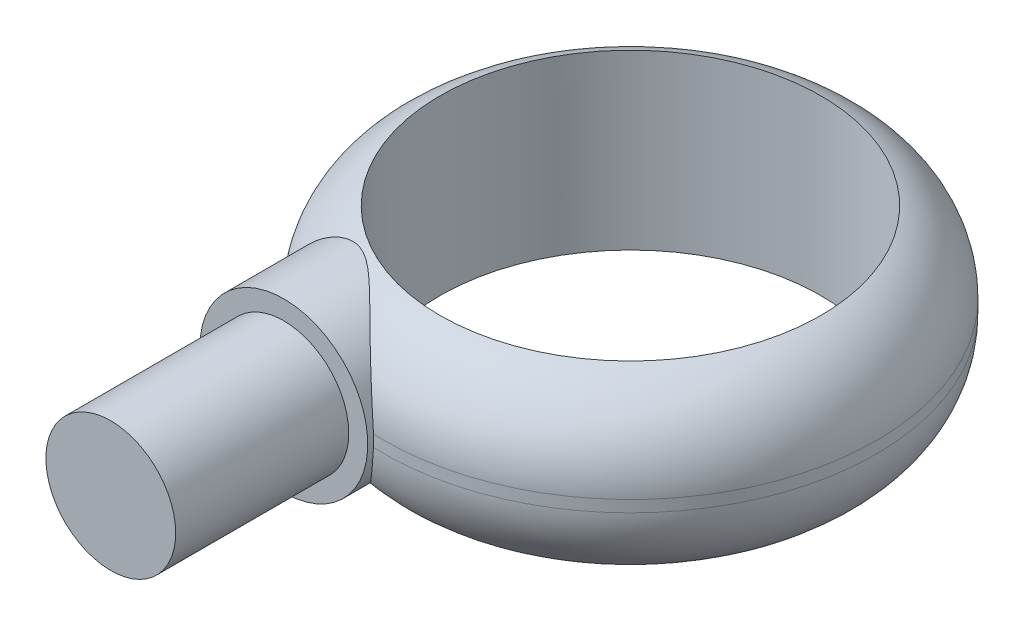
ISO-10303-21;
HEADER;
FILE_DESCRIPTION(('STEP AP214'),'2;1');
FILE_NAME('part.step','',(''),(''),'','','');
FILE_SCHEMA(('AUTOMOTIVE_DESIGN { 1 0 10303 214 1 1 1 1 }'));
ENDSEC;
DATA;
#1=APPLICATION_CONTEXT('core data for automotive mechanical design processes');
#2=APPLICATION_PROTOCOL_DEFINITION('international standard','automotive_design',2000,#1);
#3=PRODUCT_CONTEXT('',#1,'mechanical');
#4=PRODUCT('Part','Part','',(#3));
#5=PRODUCT_RELATED_PRODUCT_CATEGORY('part','',(#4));
#6=PRODUCT_DEFINITION_FORMATION('','',#4);
#7=PRODUCT_DEFINITION_CONTEXT('part definition',#1,'design');
#8=PRODUCT_DEFINITION('design','',#6,#7);
#9=PRODUCT_DEFINITION_SHAPE('','',#8);
#10=(LENGTH_UNIT() NAMED_UNIT(*) SI_UNIT(.MILLI.,.METRE.));
#11=(NAMED_UNIT(*) PLANE_ANGLE_UNIT() SI_UNIT($,.RADIAN.));
#12=(NAMED_UNIT(*) SI_UNIT($,.STERADIAN.) SOLID_ANGLE_UNIT());
#13=UNCERTAINTY_MEASURE_WITH_UNIT(LENGTH_MEASURE(1.E-05),#10,'distance_accuracy_value','');
#14=(GEOMETRIC_REPRESENTATION_CONTEXT(3) GLOBAL_UNCERTAINTY_ASSIGNED_CONTEXT((#13)) GLOBAL_UNIT_ASSIGNED_CONTEXT((#10,
#11,#12)) REPRESENTATION_CONTEXT('',''));
#15=CARTESIAN_POINT('',(0.,0.,0.));
#16=DIRECTION('',(0.,0.,1.));
#17=DIRECTION('',(1.,0.,0.));
#18=AXIS2_PLACEMENT_3D('',#15,#16,#17);
#19=CARTESIAN_POINT('',(0.,0.,12.7));
#20=DIRECTION('',(0.,0.,-1.));
#21=DIRECTION('',(-1.,0.,0.));
#22=AXIS2_PLACEMENT_3D('',#19,#20,#21);
#23=CYLINDRICAL_SURFACE('',#22,4.7625);
#24=CARTESIAN_POINT('',(0.,0.,12.7));
#25=DIRECTION('',(0.,0.,1.));
#26=DIRECTION('',(1.,0.,0.));
#27=AXIS2_PLACEMENT_3D('',#24,#25,#26);
#28=CIRCLE('',#27,4.7625);
#29=CARTESIAN_POINT('',(4.7625,0.,12.7));
#30=VERTEX_POINT('',#29);
#31=EDGE_CURVE('E80',#30,#30,#28,.T.);
#32=ORIENTED_EDGE('',*,*,#31,.F.);
#33=EDGE_LOOP('',(#32));
#34=FACE_BOUND('',#33,.T.);
#35=CARTESIAN_POINT('',(0.,0.,0.));
#36=DIRECTION('',(0.,0.,1.));
#37=DIRECTION('',(1.,0.,0.));
#38=AXIS2_PLACEMENT_3D('',#35,#36,#37);
#39=CIRCLE('',#38,4.7625);
#40=CARTESIAN_POINT('',(4.7625,0.,0.));
#41=VERTEX_POINT('',#40);
#42=EDGE_CURVE('E95',#41,#41,#39,.T.);
#43=ORIENTED_EDGE('',*,*,#42,.T.);
#44=EDGE_LOOP('',(#43));
#45=FACE_BOUND('',#44,.T.);
#46=ADVANCED_FACE('F39',(#34,#45),#23,.T.);
#47=CARTESIAN_POINT('',(0.,0.,12.7));
#48=DIRECTION('',(0.,0.,1.));
#49=DIRECTION('',(1.,0.,0.));
#50=AXIS2_PLACEMENT_3D('',#47,#48,#49);
#51=PLANE('',#50);
#52=ORIENTED_EDGE('',*,*,#31,.T.);
#53=EDGE_LOOP('',(#52));
#54=FACE_BOUND('',#53,.T.);
#55=ADVANCED_FACE('F111',(#54),#51,.T.);
#56=CARTESIAN_POINT('',(0.,0.,-6.35));
#57=DIRECTION('',(0.,0.,1.));
#58=DIRECTION('',(1.,0.,0.));
#59=AXIS2_PLACEMENT_3D('',#56,#57,#58);
#60=CYLINDRICAL_SURFACE('',#59,6.1595);
#61=CARTESIAN_POINT('',(6.1595,0.,-0.433278284133438));
#62=CARTESIAN_POINT('',(6.15950032151189,0.172561450035401,-0.43327843835306));
#63=CARTESIAN_POINT('',(6.15224445738255,0.345117413014048,-0.433606406752898));
#64=CARTESIAN_POINT('',(6.1232683325453,0.689071518725791,-0.43496916231237));
#65=CARTESIAN_POINT('',(6.10154302920773,0.860469236765324,-0.436004195888921));
#66=CARTESIAN_POINT('',(6.04379488401181,1.20072652864007,-0.438929525038681));
#67=CARTESIAN_POINT('',(6.00778050977877,1.36958754431435,-0.440819314181093));
#68=CARTESIAN_POINT('',(5.92169294821484,1.70375331226299,-0.445697540905001));
#69=CARTESIAN_POINT('',(5.87161339677958,1.86905641814388,-0.448686476009523));
#70=CARTESIAN_POINT('',(5.75774408586466,2.19490784656053,-0.456091748109535));
#71=CARTESIAN_POINT('',(5.69394925154568,2.35545438401532,-0.460508613764112));
#72=CARTESIAN_POINT('',(5.55316247789625,2.67050211720941,-0.471167784589842));
#73=CARTESIAN_POINT('',(5.47617665046422,2.82500607217129,-0.477409245296908));
#74=CARTESIAN_POINT('',(5.30952875236692,3.12699526927438,-0.492179614423664));
#75=CARTESIAN_POINT('',(5.21986114654022,3.27447740886317,-0.50070952313835));
#76=CARTESIAN_POINT('',(5.02860373379519,3.56121777171913,-0.520550013009385));
#77=CARTESIAN_POINT('',(4.92701864550526,3.70047921729143,-0.53185949554567));
#78=CARTESIAN_POINT('',(4.71336532211336,3.96899006580956,-0.557697579812131));
#79=CARTESIAN_POINT('',(4.60136550693136,4.09829585082189,-0.572205925763025));
#80=CARTESIAN_POINT('',(4.36731017886511,4.346857637888,-0.604978081559618));
#81=CARTESIAN_POINT('',(4.24525846415549,4.46611740175182,-0.623240476780409));
#82=CARTESIAN_POINT('',(3.99208346154809,4.69379302352241,-0.663998561291359));
#83=CARTESIAN_POINT('',(3.86096019018573,4.8022089011943,-0.686494242865307));
#84=CARTESIAN_POINT('',(3.59076905000158,5.00745431070971,-0.736141451234947));
#85=CARTESIAN_POINT('',(3.4517013000029,5.10428401577706,-0.763292908407787));
#86=CARTESIAN_POINT('',(3.16935236137234,5.28414311422239,-0.822076011198129));
#87=CARTESIAN_POINT('',(3.02618873830594,5.36738577689063,-0.853620197350324));
#88=CARTESIAN_POINT('',(2.73453589388077,5.52168271932362,-0.921791028792808));
#89=CARTESIAN_POINT('',(2.58604486315587,5.59273280978304,-0.958419413199415));
#90=CARTESIAN_POINT('',(2.28510261774511,5.72228743959094,-1.03687614467795));
#91=CARTESIAN_POINT('',(2.132653120489,5.78079732097098,-1.07870226551044));
#92=CARTESIAN_POINT('',(1.82492953139627,5.88519173090113,-1.16762006070106));
#93=CARTESIAN_POINT('',(1.66965440236917,5.93107151949394,-1.21471370261228));
#94=CARTESIAN_POINT('',(1.35655744394011,6.01044446217021,-1.31440412787761));
#95=CARTESIAN_POINT('',(1.19872567216711,6.04385637985861,-1.36703423361447));
#96=CARTESIAN_POINT('',(0.882621161014355,6.09804447484192,-1.47739477722207));
#97=CARTESIAN_POINT('',(0.724348283729284,6.11881611393903,-1.5351270383936));
#98=CARTESIAN_POINT('',(0.40852606262895,6.14798284680408,-1.65540923672245));
#99=CARTESIAN_POINT('',(0.250976630968003,6.15637948509119,-1.71795857163703));
#100=CARTESIAN_POINT('',(-0.0624947411158468,6.16117853526624,-1.84756887140799));
#101=CARTESIAN_POINT('',(-0.21841604173212,6.15757639768461,-1.91463153809947));
#102=CARTESIAN_POINT('',(-0.539060333655555,6.1381187260786,-2.0579293439522));
#103=CARTESIAN_POINT('',(-0.703591071962047,6.1213846482237,-2.13447652050045));
#104=CARTESIAN_POINT('',(-1.02884335916061,6.07518995128125,-2.29176083861418));
#105=CARTESIAN_POINT('',(-1.18956346887423,6.04572460220368,-2.37249952761413));
#106=CARTESIAN_POINT('',(-1.66474224009663,5.93913826731801,-2.62009910049147));
#107=CARTESIAN_POINT('',(-1.97243759451734,5.84381235191416,-2.79244154475768));
#108=CARTESIAN_POINT('',(-2.60419458906947,5.59358539081789,-3.17009994358961));
#109=CARTESIAN_POINT('',(-2.92494660215891,5.43242444301207,-3.37674420701079));
#110=CARTESIAN_POINT('',(-3.53274510596176,5.05833240435006,-3.79442677248294));
#111=CARTESIAN_POINT('',(-3.81972780941989,4.84530560011969,-4.00547253101321));
#112=CARTESIAN_POINT('',(-4.23656070927935,4.47558158558861,-4.32967240217355));
#113=CARTESIAN_POINT('',(-4.37984667569551,4.33553704198602,-4.44490915696216));
#114=CARTESIAN_POINT('',(-4.65355010896379,4.04035118185965,-4.67155336322745));
#115=CARTESIAN_POINT('',(-4.78396363587603,3.88520527185681,-4.78295963552951));
#116=CARTESIAN_POINT('',(-5.03043509633383,3.56028590056275,-4.99916307820575));
#117=CARTESIAN_POINT('',(-5.14652456474335,3.39054601982918,-5.103974508483));
#118=CARTESIAN_POINT('',(-5.36310716621565,3.03638185003433,-5.30413139845406));
#119=CARTESIAN_POINT('',(-5.46361220912722,2.85196893904061,-5.39948406639552));
#120=CARTESIAN_POINT('',(-5.66564902999966,2.42998771231142,-5.59498091581771));
#121=CARTESIAN_POINT('',(-5.7633588049525,2.18916859709919,-5.69226320768031));
#122=CARTESIAN_POINT('',(-5.88775141017033,1.81416522202869,-5.81821526265878));
#123=CARTESIAN_POINT('',(-5.92551607624295,1.68688939211838,-5.8568662123582));
#124=CARTESIAN_POINT('',(-5.99311414389299,1.42823736299574,-5.92655146598141));
#125=CARTESIAN_POINT('',(-6.0229515329071,1.29686326252404,-5.95758959856202));
#126=CARTESIAN_POINT('',(-6.07442075982425,1.02936686377469,-6.01141006281185));
#127=CARTESIAN_POINT('',(-6.09596402569768,0.893209392044427,-6.03410316992073));
#128=CARTESIAN_POINT('',(-6.12992915188676,0.618510492977326,-6.06999034757185));
#129=CARTESIAN_POINT('',(-6.14235126286339,0.479969131259917,-6.08318467915235));
#130=CARTESIAN_POINT('',(-6.15776641483959,0.201841781611924,-6.09957025761734));
#131=CARTESIAN_POINT('',(-6.16076444516669,0.0622563856686954,-6.10276679756081));
#132=CARTESIAN_POINT('',(-6.15726799056568,-0.216651698846653,-6.09904474404152));
#133=CARTESIAN_POINT('',(-6.15077431033838,-0.355974408686477,-6.09212700806023));
#134=CARTESIAN_POINT('',(-6.12994428924225,-0.614617998741855,-6.070023448736));
#135=CARTESIAN_POINT('',(-6.11676291989732,-0.734139922767015,-6.05605651281613));
#136=CARTESIAN_POINT('',(-6.08362640889022,-0.971222571011908,-6.02111739861345));
#137=CARTESIAN_POINT('',(-6.06366915944758,-1.08878267301245,-6.00014304055661));
#138=CARTESIAN_POINT('',(-5.99409481770153,-1.43748975720435,-5.92747928737275));
#139=CARTESIAN_POINT('',(-5.93476895487407,-1.66473676898593,-5.86604244606844));
#140=CARTESIAN_POINT('',(-5.76672341942466,-2.18758946448493,-5.69542786953499));
#141=CARTESIAN_POINT('',(-5.64782379422839,-2.47687359410212,-5.57698686393697));
#142=CARTESIAN_POINT('',(-5.4427934151154,-2.88773872121932,-5.37993168467121));
#143=CARTESIAN_POINT('',(-5.36986675169885,-3.02104245891786,-5.31088989306975));
#144=CARTESIAN_POINT('',(-5.21577711519251,-3.27990230682628,-5.16766581155484));
#145=CARTESIAN_POINT('',(-5.13461612882906,-3.40546027418692,-5.09348476297282));
#146=CARTESIAN_POINT('',(-4.93702853946152,-3.688345241977,-4.91644082313287));
#147=CARTESIAN_POINT('',(-4.81771597460488,-3.84272732748677,-4.81209476024554));
#148=CARTESIAN_POINT('',(-4.56679035149864,-4.13779909740781,-4.59888309712308));
#149=CARTESIAN_POINT('',(-4.43517357590581,-4.27848461744125,-4.49001613659335));
#150=CARTESIAN_POINT('',(-4.16046191498514,-4.54607268090431,-4.2696989950882));
#151=CARTESIAN_POINT('',(-4.01736239222965,-4.67296960646495,-4.15824778348762));
#152=CARTESIAN_POINT('',(-3.72045294694068,-4.91264329924761,-3.93448531304253));
#153=CARTESIAN_POINT('',(-3.56664398014809,-5.02542132397306,-3.82217413173829));
#154=CARTESIAN_POINT('',(-3.24708089733202,-5.23766394281989,-3.59683134434132));
#155=CARTESIAN_POINT('',(-3.08120808766067,-5.3369573501376,-3.48380668134183));
#156=CARTESIAN_POINT('',(-2.73982537424583,-5.51999113631155,-3.25974064178328));
#157=CARTESIAN_POINT('',(-2.56431603189095,-5.60373241993385,-3.14869915019043));
#158=CARTESIAN_POINT('',(-2.20445817822752,-5.75481297729784,-2.92989096558961));
#159=CARTESIAN_POINT('',(-2.02011157850642,-5.82215577920593,-2.82212357252761));
#160=CARTESIAN_POINT('',(-1.64348830047302,-5.93946812769961,-2.6110475934744));
#161=CARTESIAN_POINT('',(-1.4512118433075,-5.98943815840867,-2.50773888330425));
#162=CARTESIAN_POINT('',(-1.06017849980355,-6.07085535531222,-2.30686015265064));
#163=CARTESIAN_POINT('',(-0.861430955572112,-6.10232807427085,-2.2092823838972));
#164=CARTESIAN_POINT('',(-0.458679906550883,-6.14573578544661,-2.02076977130794));
#165=CARTESIAN_POINT('',(-0.254676252495386,-6.15767022218303,-1.92983511640856));
#166=CARTESIAN_POINT('',(0.156548443517792,-6.16093895162116,-1.75564543331562));
#167=CARTESIAN_POINT('',(0.363766287769816,-6.15229255849752,-1.67238328100558));
#168=CARTESIAN_POINT('',(0.779388426859274,-6.1135526349727,-1.51423947578143));
#169=CARTESIAN_POINT('',(0.987792467251654,-6.0834635440055,-1.43935609186383));
#170=CARTESIAN_POINT('',(1.3733745298212,-6.00717637812181,-1.30865137170649));
#171=CARTESIAN_POINT('',(1.55073399844754,-5.96391643965682,-1.25163733155439));
#172=CARTESIAN_POINT('',(1.90274440511578,-5.8611098994337,-1.14433858180218));
#173=CARTESIAN_POINT('',(2.07739567104956,-5.80156528584858,-1.09405305184315));
#174=CARTESIAN_POINT('',(2.42209823143404,-5.66631662962448,-1.00025230058539));
#175=CARTESIAN_POINT('',(2.59215176948205,-5.59062063495201,-0.956733726026318));
#176=CARTESIAN_POINT('',(2.92591550961662,-5.42340199552485,-0.876281838096257));
#177=CARTESIAN_POINT('',(3.08962614175729,-5.33188042606341,-0.839348077655924));
#178=CARTESIAN_POINT('',(3.39232185030053,-5.14392453900254,-0.775253467597338));
#179=CARTESIAN_POINT('',(3.5321090713182,-5.04898749089508,-0.747476022015032));
#180=CARTESIAN_POINT('',(3.80393750675398,-4.8474856993313,-0.696611151680528));
#181=CARTESIAN_POINT('',(3.93597910218585,-4.74092152856157,-0.673523496095837));
#182=CARTESIAN_POINT('',(4.19116444265097,-4.51690212506122,-0.631631035601251));
#183=CARTESIAN_POINT('',(4.31430957158704,-4.39944859275972,-0.612825563586402));
#184=CARTESIAN_POINT('',(4.55070026905666,-4.1544605443126,-0.579026802333554));
#185=CARTESIAN_POINT('',(4.66394566870137,-4.02692585625367,-0.564033578123974));
#186=CARTESIAN_POINT('',(4.87783483828507,-3.76487712002238,-0.537583864386515));
#187=CARTESIAN_POINT('',(4.978655796758,-3.63051306964267,-0.526073068826755));
#188=CARTESIAN_POINT('',(5.16910809423147,-3.35380142912926,-0.505775554076297));
#189=CARTESIAN_POINT('',(5.25873483304184,-3.21145059147526,-0.496989952600187));
#190=CARTESIAN_POINT('',(5.42609419205333,-2.91979640277897,-0.481682546179973));
#191=CARTESIAN_POINT('',(5.50382623425562,-2.7704927143364,-0.475160851226327));
#192=CARTESIAN_POINT('',(5.64683539805653,-2.46596660107697,-0.463947806900499));
#193=CARTESIAN_POINT('',(5.71211198949318,-2.31074392465769,-0.459256535430787));
#194=CARTESIAN_POINT('',(5.83498408012571,-1.98140664120971,-0.450965356730116));
#195=CARTESIAN_POINT('',(5.89137991010131,-1.80683971704156,-0.447499640274181));
#196=CARTESIAN_POINT('',(5.98839105319098,-1.45334476553127,-0.441868029237312));
#197=CARTESIAN_POINT('',(6.02900512029335,-1.27441639502622,-0.439702237281487));
#198=CARTESIAN_POINT('',(6.09411472645174,-0.913670939235295,-0.436363796101251));
#199=CARTESIAN_POINT('',(6.11861282033134,-0.731854316499146,-0.43519098945298));
#200=CARTESIAN_POINT('',(6.15130817442371,-0.366690077432403,-0.433648009336684));
#201=CARTESIAN_POINT('',(6.15949965840218,-0.183341941685244,-0.433278120279199));
#202=CARTESIAN_POINT('',(6.1595,0.,-0.433278284133438));
#203=B_SPLINE_CURVE_WITH_KNOTS('',3,(#61,#62,#63,#64,#65,#66,#67,#68,#69,#70,#71,#72,#73,#74,
#75,#76,#77,#78,#79,#80,#81,#82,#83,#84,#85,#86,#87,#88,#89,#90,#91,#92,#93,#94,#95,#96,#97,#98,
#99,#100,#101,#102,#103,#104,#105,#106,#107,#108,#109,#110,#111,#112,#113,#114,#115,#116,#117,
#118,#119,#120,#121,#122,#123,#124,#125,#126,#127,#128,#129,#130,#131,#132,#133,#134,#135,#136,
#137,#138,#139,#140,#141,#142,#143,#144,#145,#146,#147,#148,#149,#150,#151,#152,#153,#154,#155,
#156,#157,#158,#159,#160,#161,#162,#163,#164,#165,#166,#167,#168,#169,#170,#171,#172,#173,#174,
#175,#176,#177,#178,#179,#180,#181,#182,#183,#184,#185,#186,#187,#188,#189,#190,#191,#192,#193,
#194,#195,#196,#197,#198,#199,#200,#201,#202),.UNSPECIFIED.,.T.,.F.,(4,2,2,2,2,2,2,2,2,2,2,2,2,
2,2,2,2,2,2,2,2,2,2,2,2,2,2,2,2,2,2,2,2,2,2,2,2,2,2,2,2,2,2,2,2,2,2,2,2,2,2,2,2,2,2,2,2,2,2,2,2,
2,2,2,2,2,2,2,2,2,4),(0.,0.517522345774455,1.03522514360308,1.55262161070214,2.07025256362365,
2.58807537762004,3.10565890984739,3.62346905073314,4.14107485657908,4.65549269460861,
5.16971704059713,5.68394044929374,6.19815616892161,6.70330299241235,7.2086230357455,
7.71372738692314,8.21902104147876,8.72755179618741,9.23626501947509,9.74491474508003,
10.2537573528458,10.7998861359005,11.3462179943456,12.4381698132941,13.6760747071781,
14.916281583089,15.6089510676378,16.3018319082479,16.9931590506086,17.6839552386755,
18.5130366547666,18.9274471602434,19.3416488200346,19.7601585096268,20.1786566976085,
20.5969332855654,21.0151744143723,21.3779192581473,21.7407770449016,22.4662737866135,
23.4638278621411,23.964187903169,24.4644275062344,25.1273231350078,25.7904196887945,
26.453785402068,27.1170919904108,27.7881584958389,28.459185948818,29.1300689010734,
29.8009331564714,30.4708684673799,31.1408228244709,31.8101487077259,32.4793360559351,
33.0523086110152,33.625211243888,34.197829072719,34.7704080094198,35.2835237447283,
35.7966142182449,36.3096247045958,36.8226439411707,37.3271929945521,37.8319487115426,
38.3367289483372,38.8415306661382,39.3912334758962,39.9409796773226,40.4906387078892,
41.04049240766),.UNSPECIFIED.);
#204=CARTESIAN_POINT('',(6.14476807858262,-0.425752874837174,-0.433959376669087));
#205=VERTEX_POINT('',#204);
#206=CARTESIAN_POINT('',(6.14476807858262,0.425752874837174,-0.433959376669089));
#207=VERTEX_POINT('',#206);
#208=EDGE_CURVE('E77',#205,#207,#203,.T.);
#209=ORIENTED_EDGE('',*,*,#208,.T.);
#210=CARTESIAN_POINT('',(6.14476807858262,0.425752874837174,-0.433959376669089));
#211=CARTESIAN_POINT('',(6.13528772714522,0.563089006652101,-0.434374330939));
#212=CARTESIAN_POINT('',(6.12113765581368,0.700059007455174,-0.439527838319591));
#213=CARTESIAN_POINT('',(6.08385959766875,0.97200655328814,-0.459001573369193));
#214=CARTESIAN_POINT('',(6.06073870025982,1.10698558451086,-0.473314568325109));
#215=CARTESIAN_POINT('',(6.00608751270236,1.3728262650024,-0.510646143571857));
#216=CARTESIAN_POINT('',(5.97462711510804,1.50371246600935,-0.533593005507873));
#217=CARTESIAN_POINT('',(5.90374384583451,1.76156919322188,-0.587740961645927));
#218=CARTESIAN_POINT('',(5.86431978571186,1.88853913172697,-0.618943288053542));
#219=CARTESIAN_POINT('',(5.77827072733109,2.13735795292897,-0.688948987085238));
#220=CARTESIAN_POINT('',(5.73166944033958,2.25922207557725,-0.727727439965547));
#221=CARTESIAN_POINT('',(5.63184854551278,2.49769078971101,-0.81235681944245));
#222=CARTESIAN_POINT('',(5.5786260126893,2.61429302549876,-0.858210873907634));
#223=CARTESIAN_POINT('',(5.40988092575781,2.95585453929036,-1.00563755668061));
#224=CARTESIAN_POINT('',(5.28537302554399,3.17230818122448,-1.11699957402896));
#225=CARTESIAN_POINT('',(5.0579286617458,3.51940631192601,-1.32436407828453));
#226=CARTESIAN_POINT('',(4.9596008623938,3.65641625125052,-1.41507354922189));
#227=CARTESIAN_POINT('',(4.75546802632009,3.91822548718735,-1.60536333839756));
#228=CARTESIAN_POINT('',(4.64966036999565,4.04302046901229,-1.70494676769516));
#229=CARTESIAN_POINT('',(4.32287190827529,4.3995839973515,-2.01518465375671));
#230=CARTESIAN_POINT('',(4.09269670718666,4.61327821173251,-2.23717040958358));
#231=CARTESIAN_POINT('',(3.68256415127702,4.94235801615474,-2.63673928224807));
#232=CARTESIAN_POINT('',(3.50635457080554,5.06857932952554,-2.80959222981415));
#233=CARTESIAN_POINT('',(3.14699360798574,5.29919376776427,-3.16277320739139));
#234=CARTESIAN_POINT('',(2.96383790923992,5.40357304823772,-3.34310589213896));
#235=CARTESIAN_POINT('',(2.59099175462888,5.59195461772727,-3.70805842257183));
#236=CARTESIAN_POINT('',(2.40129367803986,5.675932159304,-3.89268318020746));
#237=CARTESIAN_POINT('',(2.11130624249587,5.7872705762159,-4.16960986128493));
#238=CARTESIAN_POINT('',(2.01375323338937,5.82194098162499,-4.26190211203151));
#239=CARTESIAN_POINT('',(1.8164936432245,5.8864735081432,-4.44585816650123));
#240=CARTESIAN_POINT('',(1.71678727378112,5.91633609930922,-4.5375220308213));
#241=CARTESIAN_POINT('',(1.50918966707247,5.97277100930113,-4.72449722026195));
#242=CARTESIAN_POINT('',(1.40115128859947,5.99906873740469,-4.81972863543499));
#243=CARTESIAN_POINT('',(1.18154747903117,6.04615554790997,-5.00742376503151));
#244=CARTESIAN_POINT('',(1.06998285713452,6.0669458840158,-5.09988810509415));
#245=CARTESIAN_POINT('',(0.842737758373993,6.10265809059389,-5.28029329282769));
#246=CARTESIAN_POINT('',(0.727067344905036,6.11759335697579,-5.36824406137163));
#247=CARTESIAN_POINT('',(0.490507893322478,6.14108811977296,-5.53778295571929));
#248=CARTESIAN_POINT('',(0.369620611561328,6.14964974454385,-5.6193731973438));
#249=CARTESIAN_POINT('',(0.153479956800188,6.15827974691741,-5.7540179997803));
#250=CARTESIAN_POINT('',(0.0595287912616215,6.15995467216326,-5.80905166856556));
#251=CARTESIAN_POINT('',(-0.131661290552404,6.15883414448888,-5.91299787865489));
#252=CARTESIAN_POINT('',(-0.228898901180281,6.15604044690676,-5.9619128153461));
#253=CARTESIAN_POINT('',(-0.426194968805249,6.1455290913857,-6.05246977699499));
#254=CARTESIAN_POINT('',(-0.526246312998967,6.13782294004421,-6.09412850882821));
#255=CARTESIAN_POINT('',(-0.728750207079622,6.11708402573293,-6.16955953117676));
#256=CARTESIAN_POINT('',(-0.831202662882605,6.10405147114241,-6.20333213013175));
#257=CARTESIAN_POINT('',(-1.0378178153565,6.07234058459246,-6.26282310765677));
#258=CARTESIAN_POINT('',(-1.14198387624092,6.05364945945277,-6.28852296385526));
#259=CARTESIAN_POINT('',(-1.35075029761616,6.01051389071174,-6.33210852445782));
#260=CARTESIAN_POINT('',(-1.45535068891313,5.98606903191833,-6.34999366468222));
#261=CARTESIAN_POINT('',(-1.66432809304217,5.93137051781218,-6.37880245385284));
#262=CARTESIAN_POINT('',(-1.76870336577558,5.90109881658052,-6.38970400819038));
#263=CARTESIAN_POINT('',(-1.97612347289669,5.83491553905094,-6.40552904191745));
#264=CARTESIAN_POINT('',(-2.07916782001843,5.79900195718702,-6.41045039001855));
#265=CARTESIAN_POINT('',(-2.32521527404662,5.70583052096615,-6.41646836541815));
#266=CARTESIAN_POINT('',(-2.46725444012753,5.64586319347686,-6.41516512171457));
#267=CARTESIAN_POINT('',(-2.74625990758466,5.5155448345375,-6.40581474309488));
#268=CARTESIAN_POINT('',(-2.88322411691221,5.44518957915681,-6.39776485860936));
#269=CARTESIAN_POINT('',(-3.15132234216521,5.29455017741049,-6.37728046290795));
#270=CARTESIAN_POINT('',(-3.28245298866805,5.21426039161772,-6.36484345381841));
#271=CARTESIAN_POINT('',(-3.53816763970391,5.04424316615016,-6.33742994991469));
#272=CARTESIAN_POINT('',(-3.66275111179018,4.95451496067466,-6.32245324897826));
#273=CARTESIAN_POINT('',(-3.90865402434516,4.76307780319983,-6.29088805379285));
#274=CARTESIAN_POINT('',(-4.02974228691449,4.66107781874455,-6.27426336752544));
#275=CARTESIAN_POINT('',(-4.26371370143857,4.4480576380006,-6.24103500978839));
#276=CARTESIAN_POINT('',(-4.37659661421929,4.3370371789778,-6.22443133894516));
#277=CARTESIAN_POINT('',(-4.59351379607709,4.10659238609387,-6.19219378094108));
#278=CARTESIAN_POINT('',(-4.69755070410292,3.98717057809613,-6.176559604939));
#279=CARTESIAN_POINT('',(-4.89621142979145,3.74053859851774,-6.14700514804692));
#280=CARTESIAN_POINT('',(-4.99083516448444,3.61332835830414,-6.13308488226344));
#281=CARTESIAN_POINT('',(-5.17881685363215,3.33909391635665,-6.10632148493369));
#282=CARTESIAN_POINT('',(-5.2711560570411,3.19134609223111,-6.09371489962518));
#283=CARTESIAN_POINT('',(-5.44304483120047,2.88842860171917,-6.0719465348218));
#284=CARTESIAN_POINT('',(-5.5225996326465,2.733262004589,-6.06278334440891));
#285=CARTESIAN_POINT('',(-5.66831527179183,2.41661028558449,-6.04841407307259));
#286=CARTESIAN_POINT('',(-5.7344785508512,2.25512632182356,-6.04320727039685));
#287=CARTESIAN_POINT('',(-5.85286488310925,1.92712583923914,-6.03716484376232));
#288=CARTESIAN_POINT('',(-5.90509291653435,1.76061114206469,-6.0363276561845));
#289=CARTESIAN_POINT('',(-6.00127158817288,1.40115785071819,-6.0395579592168));
#290=CARTESIAN_POINT('',(-6.04317509306085,1.20766851957105,-6.04429774511879));
#291=CARTESIAN_POINT('',(-6.09188304157144,0.915505855264036,-6.05620580348982));
#292=CARTESIAN_POINT('',(-6.10575706109732,0.817855851882093,-6.06097060367056));
#293=CARTESIAN_POINT('',(-6.12879654270926,0.622095229101978,-6.07213140073318));
#294=CARTESIAN_POINT('',(-6.13796203029837,0.523984612201555,-6.07852738877969));
#295=CARTESIAN_POINT('',(-6.14476807858262,0.425752874837174,-6.08575598536835));
#296=B_SPLINE_CURVE_WITH_KNOTS('',3,(#210,#211,#212,#213,#214,#215,#216,#217,#218,#219,#220,
#221,#222,#223,#224,#225,#226,#227,#228,#229,#230,#231,#232,#233,#234,#235,#236,#237,#238,#239,
#240,#241,#242,#243,#244,#245,#246,#247,#248,#249,#250,#251,#252,#253,#254,#255,#256,#257,#258,
#259,#260,#261,#262,#263,#264,#265,#266,#267,#268,#269,#270,#271,#272,#273,#274,#275,#276,#277,
#278,#279,#280,#281,#282,#283,#284,#285,#286,#287,#288,#289,#290,#291,#292,#293,#294,#295),
.UNSPECIFIED.,.F.,.F.,(4,2,2,2,2,2,2,2,2,2,2,2,2,2,2,2,2,2,2,2,2,2,2,2,2,2,2,2,2,2,2,2,2,2,2,2,
2,2,2,2,2,2,4),(0.,0.412789677378421,0.825253800357431,1.23436477914708,1.64353685607344,
2.05138506102254,2.45941408023657,3.27632165042172,3.85009907190221,4.42407844741959,
5.57305351508948,6.40380701536237,7.23508549757411,8.06736734684965,8.48337395882878,
8.89933987337794,9.33839166701069,9.77734342872749,10.215284961187,10.653080185774,
10.979503644986,11.3057989119424,11.6313326814109,11.9568537165833,12.2831162728854,
12.609402379666,12.9367157547616,13.2641457470398,13.7260076276323,14.1880578299716,
14.6503715331187,15.1127227757748,15.5898344794171,16.0669600846006,16.5439428501313,
17.0209298195174,17.5443218107023,18.067499109553,18.5905809437601,19.1134755860077,
19.7064417676405,20.0025707434738,20.2986981153526),.UNSPECIFIED.);
#297=CARTESIAN_POINT('',(-6.14476807858262,0.425752874837174,-6.08575598536836));
#298=VERTEX_POINT('',#297);
#299=EDGE_CURVE('E11',#207,#298,#296,.T.);
#300=ORIENTED_EDGE('',*,*,#299,.T.);
#301=CARTESIAN_POINT('',(-6.14476807858262,-0.425752874837174,-6.08575598536835));
#302=VERTEX_POINT('',#301);
#303=EDGE_CURVE('E78',#298,#302,#203,.T.);
#304=ORIENTED_EDGE('',*,*,#303,.T.);
#305=CARTESIAN_POINT('',(-6.14476807858262,-0.425752874837174,-6.08575598536835));
#306=CARTESIAN_POINT('',(-6.13329461059954,-0.591689360834652,-6.07353621388995));
#307=CARTESIAN_POINT('',(-6.11504158967459,-0.75732617740854,-6.06370542826004));
#308=CARTESIAN_POINT('',(-6.06515197407387,-1.086757815931,-6.04862943115386));
#309=CARTESIAN_POINT('',(-6.03351743978963,-1.25055291746979,-6.0433835141128));
#310=CARTESIAN_POINT('',(-5.95712452580574,-1.57473756318451,-6.03728822241481));
#311=CARTESIAN_POINT('',(-5.91239645710028,-1.73513406543076,-6.03642877703633));
#312=CARTESIAN_POINT('',(-5.81011448025925,-2.05175097684787,-6.03881442226012));
#313=CARTESIAN_POINT('',(-5.75256050371615,-2.20797136374027,-6.04205953475468));
#314=CARTESIAN_POINT('',(-5.62505434269035,-2.51512522712657,-6.05232606476277));
#315=CARTESIAN_POINT('',(-5.55510287662672,-2.66605900936597,-6.05934726350475));
#316=CARTESIAN_POINT('',(-5.40331368362492,-2.96162857010529,-6.07675948493985));
#317=CARTESIAN_POINT('',(-5.32147538087021,-3.10626404306407,-6.08715067091039));
#318=CARTESIAN_POINT('',(-5.14648579821625,-3.3883144463348,-6.11080563089448));
#319=CARTESIAN_POINT('',(-5.05333200411745,-3.52572776219624,-6.12407004382768));
#320=CARTESIAN_POINT('',(-4.85637135935932,-3.79243732530347,-6.15285347190109));
#321=CARTESIAN_POINT('',(-4.75256453925086,-3.92173359582572,-6.1683724805756));
#322=CARTESIAN_POINT('',(-4.532568394154,-4.17419629716881,-6.20125925593961));
#323=CARTESIAN_POINT('',(-4.41615611637348,-4.29716410936125,-6.21866030050093));
#324=CARTESIAN_POINT('',(-4.17364843869094,-4.53306910986895,-6.2539844184068));
#325=CARTESIAN_POINT('',(-4.04755288137303,-4.64600613505468,-6.27190750023489));
#326=CARTESIAN_POINT('',(-3.78634592315784,-4.86124323249522,-6.30694918251111));
#327=CARTESIAN_POINT('',(-3.65122873240376,-4.96353636392624,-6.32406725407902));
#328=CARTESIAN_POINT('',(-3.37283093185183,-5.15675744793237,-6.35572606220317));
#329=CARTESIAN_POINT('',(-3.22955220451502,-5.24768800595964,-6.37026738993088));
#330=CARTESIAN_POINT('',(-2.97019135392138,-5.39761734037056,-6.39157708535127));
#331=CARTESIAN_POINT('',(-2.85562379537126,-5.459100274493,-6.3993688943125));
#332=CARTESIAN_POINT('',(-2.62266393870394,-5.57476235411028,-6.41070364414681));
#333=CARTESIAN_POINT('',(-2.50427255553051,-5.62894323098531,-6.41424759380235));
#334=CARTESIAN_POINT('',(-2.26451388256897,-5.72959703600291,-6.41546064297782));
#335=CARTESIAN_POINT('',(-2.14315378468087,-5.77608681283392,-6.41314277039037));
#336=CARTESIAN_POINT('',(-1.89807456438562,-5.86119098056962,-6.40080371054117));
#337=CARTESIAN_POINT('',(-1.77435612683763,-5.89980762084453,-6.39078472741459));
#338=CARTESIAN_POINT('',(-1.54974536211353,-5.96226320223776,-6.36403404140693));
#339=CARTESIAN_POINT('',(-1.44904824900813,-5.98751584420695,-6.34896780379969));
#340=CARTESIAN_POINT('',(-1.24776375985703,-6.03267408745054,-6.31179323502823));
#341=CARTESIAN_POINT('',(-1.14717636169877,-6.05258111376315,-6.28968678409124));
#342=CARTESIAN_POINT('',(-0.947213640071811,-6.08707668828024,-6.23800964865877));
#343=CARTESIAN_POINT('',(-0.84783638427373,-6.10167522244526,-6.20845315794019));
#344=CARTESIAN_POINT('',(-0.650986091940725,-6.12580580140551,-6.14186995589516));
#345=CARTESIAN_POINT('',(-0.55351326758445,-6.13533728473047,-6.10484241734296));
#346=CARTESIAN_POINT('',(-0.338589891045229,-6.15133946809218,-6.01428615656509));
#347=CARTESIAN_POINT('',(-0.221818615295617,-6.15656710619454,-5.95892419553257));
#348=CARTESIAN_POINT('',(0.00710564112537875,-6.16056159179153,-5.8391812170153));
#349=CARTESIAN_POINT('',(0.119256715037412,-6.15932579822088,-5.77479652315186));
#350=CARTESIAN_POINT('',(0.339533005954063,-6.1511280279774,-5.63858397664927));
#351=CARTESIAN_POINT('',(0.447632442645219,-6.14413432826669,-5.56671682031915));
#352=CARTESIAN_POINT('',(0.659637496529692,-6.12500232783149,-5.41762789125325));
#353=CARTESIAN_POINT('',(0.763540919019674,-6.11286137207549,-5.34040337232751));
#354=CARTESIAN_POINT('',(0.969698403047723,-6.0835990401168,-5.18061439358647));
#355=CARTESIAN_POINT('',(1.07188092627036,-6.06638526789255,-5.09797522412591));
#356=CARTESIAN_POINT('',(1.27307616089549,-6.02737085948095,-4.93003093050308));
#357=CARTESIAN_POINT('',(1.37208935775623,-6.00557092968468,-4.84472621862669));
#358=CARTESIAN_POINT('',(1.66547729335989,-5.93349233789567,-4.58613900290497));
#359=CARTESIAN_POINT('',(1.8560186936075,-5.87656165552175,-4.41032966769281));
#360=CARTESIAN_POINT('',(2.22983590334311,-5.74512295598388,-4.05765252229799));
#361=CARTESIAN_POINT('',(2.41311157515418,-5.67061460592974,-3.88078469213113));
#362=CARTESIAN_POINT('',(2.77363054300966,-5.50325971059822,-3.52977058384987));
#363=CARTESIAN_POINT('',(2.95087771474499,-5.41042521871815,-3.35562259766077));
#364=CARTESIAN_POINT('',(3.26643440688885,-5.22462398558404,-3.04539896484429));
#365=CARTESIAN_POINT('',(3.40576486748046,-5.13500694545635,-2.90835514136331));
#366=CARTESIAN_POINT('',(3.68002060102355,-4.94216553975595,-2.63943202178526));
#367=CARTESIAN_POINT('',(3.81494530062187,-4.83893941187135,-2.50755339743056));
#368=CARTESIAN_POINT('',(4.07914790567915,-4.61838863083048,-2.25080206589344));
#369=CARTESIAN_POINT('',(4.2084377665588,-4.50109602896439,-2.1259143480352));
#370=CARTESIAN_POINT('',(4.46030851734034,-4.25165204627296,-1.88451937629004));
#371=CARTESIAN_POINT('',(4.58288919939894,-4.11950020551103,-1.76801238199399));
#372=CARTESIAN_POINT('',(4.87472145600081,-3.77470645833132,-1.4933631849378));
#373=CARTESIAN_POINT('',(5.03923945185586,-3.55316750576082,-1.34098349778185));
#374=CARTESIAN_POINT('',(5.2670254801224,-3.19653368119952,-1.13403093141792));
#375=CARTESIAN_POINT('',(5.33979636492623,-3.07358576907788,-1.06864321336813));
#376=CARTESIAN_POINT('',(5.47805836770794,-2.81978168891861,-0.945926667365668));
#377=CARTESIAN_POINT('',(5.54355086594623,-2.68892702759378,-0.888596310881531));
#378=CARTESIAN_POINT('',(5.65617539799532,-2.44181072630842,-0.791573527849542));
#379=CARTESIAN_POINT('',(5.70456004849995,-2.32664774708499,-0.750529353189891));
#380=CARTESIAN_POINT('',(5.79485200257446,-2.09164190876507,-0.675306388614749));
#381=CARTESIAN_POINT('',(5.83676056841646,-1.97179996737724,-0.641126260418343));
#382=CARTESIAN_POINT('',(5.91345024393513,-1.72824150729416,-0.580193520074753));
#383=CARTESIAN_POINT('',(5.94824318562303,-1.60453182154211,-0.553428551114994));
#384=CARTESIAN_POINT('',(6.01025538647043,-1.35385843425052,-0.507712555364943));
#385=CARTESIAN_POINT('',(6.03747802102904,-1.22689621059819,-0.488758044276624));
#386=CARTESIAN_POINT('',(6.08080142998276,-0.987912429845333,-0.461026364261152));
#387=CARTESIAN_POINT('',(6.09790820499077,-0.87619127491612,-0.451219784652464));
#388=CARTESIAN_POINT('',(6.12598126259288,-0.651646168745993,-0.437863610650417));
#389=CARTESIAN_POINT('',(6.13694943570474,-0.538822567930738,-0.434312089149833));
#390=CARTESIAN_POINT('',(6.14476807858262,-0.425752874837174,-0.433959376669089));
#391=B_SPLINE_CURVE_WITH_KNOTS('',3,(#305,#306,#307,#308,#309,#310,#311,#312,#313,#314,#315,
#316,#317,#318,#319,#320,#321,#322,#323,#324,#325,#326,#327,#328,#329,#330,#331,#332,#333,#334,
#335,#336,#337,#338,#339,#340,#341,#342,#343,#344,#345,#346,#347,#348,#349,#350,#351,#352,#353,
#354,#355,#356,#357,#358,#359,#360,#361,#362,#363,#364,#365,#366,#367,#368,#369,#370,#371,#372,
#373,#374,#375,#376,#377,#378,#379,#380,#381,#382,#383,#384,#385,#386,#387,#388,#389,#390),
.UNSPECIFIED.,.F.,.F.,(4,2,2,2,2,2,2,2,2,2,2,2,2,2,2,2,2,2,2,2,2,2,2,2,2,2,2,2,2,2,2,2,2,2,2,2,
2,2,2,2,2,2,4),(0.,0.500180120903235,1.00028325559805,1.49923770574832,1.99819481715769,
2.49712302407322,2.9960754078991,3.49513885790453,3.99420087672967,4.50429214845389,
5.01439171421495,5.5248218555062,6.03513473891716,6.4256106015763,6.81599371556723,
7.20550996641271,7.59491477528714,7.90928546208521,8.22357226032657,8.53726474801167,
8.85099198812381,9.23833697957913,9.6258402589791,10.0154928782872,10.4053467312386,
10.8027936022217,11.2001793005038,11.9956527448032,12.7911412551841,13.5861082928332,
14.2306333772362,14.8752420066916,15.5184088092012,16.1615955250746,17.1031992292174,
17.5741107951182,18.0449329052395,18.4390001800746,18.832990548988,19.2263203580084,
19.6194745094822,19.9594816675577,20.2993840552324),.UNSPECIFIED.);
#392=EDGE_CURVE('E53',#302,#205,#391,.T.);
#393=ORIENTED_EDGE('',*,*,#392,.T.);
#394=EDGE_LOOP('',(#209,#300,#304,#393));
#395=FACE_BOUND('',#394,.T.);
#396=CARTESIAN_POINT('',(0.,0.,0.));
#397=DIRECTION('',(0.,0.,-1.));
#398=DIRECTION('',(-1.,0.,0.));
#399=AXIS2_PLACEMENT_3D('',#396,#397,#398);
#400=CIRCLE('',#399,6.1595);
#401=CARTESIAN_POINT('',(-6.1595,0.,0.));
#402=VERTEX_POINT('',#401);
#403=EDGE_CURVE('E86',#402,#402,#400,.T.);
#404=ORIENTED_EDGE('',*,*,#403,.T.);
#405=EDGE_LOOP('',(#404));
#406=FACE_BOUND('',#405,.T.);
#407=ADVANCED_FACE('F82',(#395,#406),#60,.T.);
#408=CARTESIAN_POINT('',(0.,0.,0.));
#409=DIRECTION('',(0.,0.,-1.));
#410=DIRECTION('',(-1.,0.,0.));
#411=AXIS2_PLACEMENT_3D('',#408,#409,#410);
#412=PLANE('',#411);
#413=ORIENTED_EDGE('',*,*,#42,.F.);
#414=EDGE_LOOP('',(#413));
#415=FACE_BOUND('',#414,.T.);
#416=ORIENTED_EDGE('',*,*,#403,.F.);
#417=EDGE_LOOP('',(#416));
#418=FACE_BOUND('',#417,.T.);
#419=ADVANCED_FACE('F105',(#415,#418),#412,.F.);
#420=CARTESIAN_POINT('',(6.98500000000006,-6.35,-18.4483748908686));
#421=DIRECTION('',(0.,1.,0.));
#422=DIRECTION('',(0.,0.,1.));
#423=AXIS2_PLACEMENT_3D('',#420,#421,#422);
#424=CYLINDRICAL_SURFACE('',#423,18.034);
#425=ORIENTED_EDGE('',*,*,#208,.F.);
#426=CARTESIAN_POINT('',(6.98500000000006,-0.425752874837174,-18.4483748908686));
#427=DIRECTION('',(0.,-1.,0.));
#428=DIRECTION('',(0.,0.,-1.));
#429=AXIS2_PLACEMENT_3D('',#426,#427,#428);
#430=CIRCLE('',#429,18.034);
#431=EDGE_CURVE('E79',#205,#302,#430,.F.);
#432=ORIENTED_EDGE('',*,*,#431,.T.);
#433=ORIENTED_EDGE('',*,*,#303,.F.);
#434=CARTESIAN_POINT('',(6.98500000000006,0.425752874837174,-18.4483748908686));
#435=DIRECTION('',(0.,1.,0.));
#436=DIRECTION('',(0.,0.,1.));
#437=AXIS2_PLACEMENT_3D('',#434,#435,#436);
#438=CIRCLE('',#437,18.034);
#439=EDGE_CURVE('E73',#298,#207,#438,.F.);
#440=ORIENTED_EDGE('',*,*,#439,.T.);
#441=EDGE_LOOP('',(#425,#432,#433,#440));
#442=FACE_BOUND('',#441,.T.);
#443=ADVANCED_FACE('F76',(#442),#424,.T.);
#444=CARTESIAN_POINT('',(6.98500000000006,-6.35,-18.4483748908686));
#445=DIRECTION('',(0.,1.,0.));
#446=DIRECTION('',(0.,0.,1.));
#447=AXIS2_PLACEMENT_3D('',#444,#445,#446);
#448=CYLINDRICAL_SURFACE('',#447,13.97);
#449=CARTESIAN_POINT('',(6.98500000000006,-6.35,-18.4483748908686));
#450=DIRECTION('',(0.,1.,0.));
#451=DIRECTION('',(0.,0.,1.));
#452=AXIS2_PLACEMENT_3D('',#449,#450,#451);
#453=CIRCLE('',#452,13.97);
#454=CARTESIAN_POINT('',(6.98500000000006,-6.35,-4.47837489086858));
#455=VERTEX_POINT('',#454);
#456=EDGE_CURVE('E84',#455,#455,#453,.T.);
#457=ORIENTED_EDGE('',*,*,#456,.F.);
#458=EDGE_LOOP('',(#457));
#459=FACE_BOUND('',#458,.T.);
#460=CARTESIAN_POINT('',(6.98500000000006,6.35,-18.4483748908686));
#461=DIRECTION('',(0.,1.,0.));
#462=DIRECTION('',(0.,0.,1.));
#463=AXIS2_PLACEMENT_3D('',#460,#461,#462);
#464=CIRCLE('',#463,13.97);
#465=CARTESIAN_POINT('',(6.98500000000006,6.35,-4.47837489086858));
#466=VERTEX_POINT('',#465);
#467=EDGE_CURVE('E88',#466,#466,#464,.T.);
#468=ORIENTED_EDGE('',*,*,#467,.T.);
#469=EDGE_LOOP('',(#468));
#470=FACE_BOUND('',#469,.T.);
#471=ADVANCED_FACE('F104',(#459,#470),#448,.F.);
#472=CARTESIAN_POINT('',(6.98500000000006,-0.425752874837174,-18.4483748908686));
#473=DIRECTION('',(0.,-1.,0.));
#474=DIRECTION('',(0.,0.,-1.));
#475=AXIS2_PLACEMENT_3D('',#472,#473,#474);
#476=TOROIDAL_SURFACE('',#475,11.684,6.35);
#477=ORIENTED_EDGE('',*,*,#456,.T.);
#478=EDGE_LOOP('',(#477));
#479=FACE_BOUND('',#478,.T.);
#480=ORIENTED_EDGE('',*,*,#392,.F.);
#481=ORIENTED_EDGE('',*,*,#431,.F.);
#482=EDGE_LOOP('',(#480,#481));
#483=FACE_BOUND('',#482,.T.);
#484=ADVANCED_FACE('F123',(#479,#483),#476,.T.);
#485=CARTESIAN_POINT('',(6.98500000000006,0.425752874837174,-18.4483748908686));
#486=DIRECTION('',(0.,1.,0.));
#487=DIRECTION('',(0.,0.,1.));
#488=AXIS2_PLACEMENT_3D('',#485,#486,#487);
#489=TOROIDAL_SURFACE('',#488,11.684,6.35);
#490=ORIENTED_EDGE('',*,*,#299,.F.);
#491=ORIENTED_EDGE('',*,*,#439,.F.);
#492=EDGE_LOOP('',(#490,#491));
#493=FACE_BOUND('',#492,.T.);
#494=ORIENTED_EDGE('',*,*,#467,.F.);
#495=EDGE_LOOP('',(#494));
#496=FACE_BOUND('',#495,.T.);
#497=ADVANCED_FACE('F41',(#493,#496),#489,.T.);
#498=CLOSED_SHELL('',(#46,#55,#407,#419,#443,#471,#484,#497));
#499=MANIFOLD_SOLID_BREP('B2',#498);
#500=ADVANCED_BREP_SHAPE_REPRESENTATION('',(#18,#499),#14);
#501=SHAPE_DEFINITION_REPRESENTATION(#9,#500);
ENDSEC;
END-ISO-10303-21;
